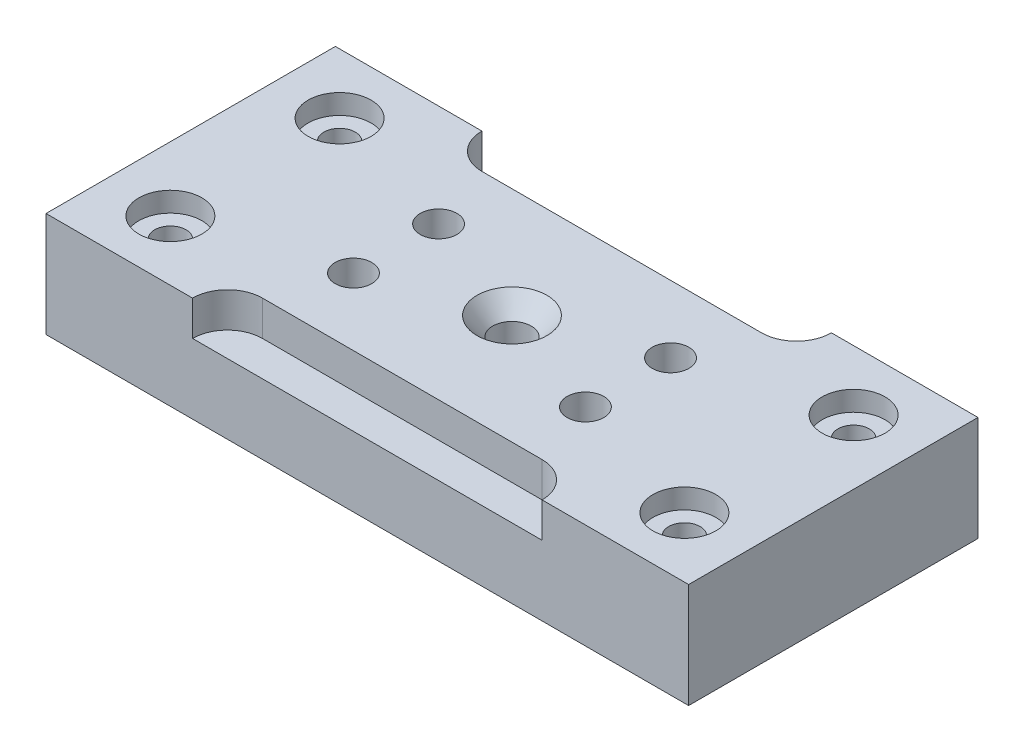
ISO-10303-21;
HEADER;
FILE_DESCRIPTION(('STEP AP214'),'2;1');
FILE_NAME('part.step','',(''),(''),'','','');
FILE_SCHEMA(('AUTOMOTIVE_DESIGN { 1 0 10303 214 1 1 1 1 }'));
ENDSEC;
DATA;
#1=APPLICATION_CONTEXT('core data for automotive mechanical design processes');
#2=APPLICATION_PROTOCOL_DEFINITION('international standard','automotive_design',2000,#1);
#3=PRODUCT_CONTEXT('',#1,'mechanical');
#4=PRODUCT('Part','Part','',(#3));
#5=PRODUCT_RELATED_PRODUCT_CATEGORY('part','',(#4));
#6=PRODUCT_DEFINITION_FORMATION('','',#4);
#7=PRODUCT_DEFINITION_CONTEXT('part definition',#1,'design');
#8=PRODUCT_DEFINITION('design','',#6,#7);
#9=PRODUCT_DEFINITION_SHAPE('','',#8);
#10=(LENGTH_UNIT() NAMED_UNIT(*) SI_UNIT(.MILLI.,.METRE.));
#11=(NAMED_UNIT(*) PLANE_ANGLE_UNIT() SI_UNIT($,.RADIAN.));
#12=(NAMED_UNIT(*) SI_UNIT($,.STERADIAN.) SOLID_ANGLE_UNIT());
#13=UNCERTAINTY_MEASURE_WITH_UNIT(LENGTH_MEASURE(1.E-05),#10,'distance_accuracy_value','');
#14=(GEOMETRIC_REPRESENTATION_CONTEXT(3) GLOBAL_UNCERTAINTY_ASSIGNED_CONTEXT((#13)) GLOBAL_UNIT_ASSIGNED_CONTEXT((#10,
#11,#12)) REPRESENTATION_CONTEXT('',''));
#15=CARTESIAN_POINT('',(0.,0.,0.));
#16=DIRECTION('',(0.,0.,1.));
#17=DIRECTION('',(1.,0.,0.));
#18=AXIS2_PLACEMENT_3D('',#15,#16,#17);
#19=CARTESIAN_POINT('',(0.,30.,0.));
#20=DIRECTION('',(0.,-1.,0.));
#21=DIRECTION('',(0.,0.,-1.));
#22=AXIS2_PLACEMENT_3D('',#19,#20,#21);
#23=PLANE('',#22);
#24=CARTESIAN_POINT('',(33.1797050328268,30.,12.1730735997061));
#25=DIRECTION('',(0.,1.,0.));
#26=DIRECTION('',(0.,0.,1.));
#27=AXIS2_PLACEMENT_3D('',#24,#25,#26);
#28=CIRCLE('',#27,5.25);
#29=CARTESIAN_POINT('',(33.1797050328268,30.,17.423073599706));
#30=VERTEX_POINT('',#29);
#31=EDGE_CURVE('E374',#30,#30,#28,.T.);
#32=ORIENTED_EDGE('',*,*,#31,.F.);
#33=EDGE_LOOP('',(#32));
#34=FACE_BOUND('',#33,.T.);
#35=CARTESIAN_POINT('',(33.1797050328268,30.,-12.1730735997061));
#36=DIRECTION('',(0.,1.,0.));
#37=DIRECTION('',(0.,0.,1.));
#38=AXIS2_PLACEMENT_3D('',#35,#36,#37);
#39=CIRCLE('',#38,5.25);
#40=CARTESIAN_POINT('',(33.1797050328268,30.,-6.92307359970605));
#41=VERTEX_POINT('',#40);
#42=EDGE_CURVE('E373',#41,#41,#39,.T.);
#43=ORIENTED_EDGE('',*,*,#42,.F.);
#44=EDGE_LOOP('',(#43));
#45=FACE_BOUND('',#44,.T.);
#46=CARTESIAN_POINT('',(-33.1797050328268,30.,12.1730735997061));
#47=DIRECTION('',(0.,1.,0.));
#48=DIRECTION('',(0.,0.,1.));
#49=AXIS2_PLACEMENT_3D('',#46,#47,#48);
#50=CIRCLE('',#49,5.25);
#51=CARTESIAN_POINT('',(-33.1797050328268,30.,17.423073599706));
#52=VERTEX_POINT('',#51);
#53=EDGE_CURVE('E384',#52,#52,#50,.T.);
#54=ORIENTED_EDGE('',*,*,#53,.F.);
#55=EDGE_LOOP('',(#54));
#56=FACE_BOUND('',#55,.T.);
#57=CARTESIAN_POINT('',(-33.1797050328268,30.,-12.1730735997061));
#58=DIRECTION('',(0.,1.,0.));
#59=DIRECTION('',(0.,0.,1.));
#60=AXIS2_PLACEMENT_3D('',#57,#58,#59);
#61=CIRCLE('',#60,5.25);
#62=CARTESIAN_POINT('',(-33.1797050328268,30.,-6.92307359970605));
#63=VERTEX_POINT('',#62);
#64=EDGE_CURVE('E390',#63,#63,#61,.T.);
#65=ORIENTED_EDGE('',*,*,#64,.F.);
#66=EDGE_LOOP('',(#65));
#67=FACE_BOUND('',#66,.T.);
#68=DIRECTION('',(-1.,0.,0.));
#69=VECTOR('',#68,1.);
#70=CARTESIAN_POINT('',(-91.9250024387865,30.,-41.3923661549649));
#71=LINE('',#70,#69);
#72=CARTESIAN_POINT('',(91.9250024387865,30.,-41.3923661549649));
#73=VERTEX_POINT('',#72);
#74=CARTESIAN_POINT('',(50.,30.,-41.3923661549649));
#75=VERTEX_POINT('',#74);
#76=EDGE_CURVE('E504',#73,#75,#71,.T.);
#77=ORIENTED_EDGE('',*,*,#76,.T.);
#78=CARTESIAN_POINT('',(40.,30.,-41.3923661549649));
#79=DIRECTION('',(0.,1.,0.));
#80=DIRECTION('',(0.,0.,1.));
#81=AXIS2_PLACEMENT_3D('',#78,#79,#80);
#82=CIRCLE('',#81,9.99999999999999);
#83=CARTESIAN_POINT('',(40.,30.,-31.392366154965));
#84=VERTEX_POINT('',#83);
#85=EDGE_CURVE('E407',#84,#75,#82,.T.);
#86=ORIENTED_EDGE('',*,*,#85,.F.);
#87=DIRECTION('',(1.,0.,0.));
#88=VECTOR('',#87,1.);
#89=CARTESIAN_POINT('',(-40.,30.,-31.392366154965));
#90=LINE('',#89,#88);
#91=CARTESIAN_POINT('',(-40.,30.,-31.3923661549649));
#92=VERTEX_POINT('',#91);
#93=EDGE_CURVE('E396',#92,#84,#90,.T.);
#94=ORIENTED_EDGE('',*,*,#93,.F.);
#95=CARTESIAN_POINT('',(-40.,30.,-41.3923661549649));
#96=DIRECTION('',(0.,1.,0.));
#97=DIRECTION('',(0.,0.,1.));
#98=AXIS2_PLACEMENT_3D('',#95,#96,#97);
#99=CIRCLE('',#98,9.99999999999999);
#100=CARTESIAN_POINT('',(-50.,30.,-41.3923661549649));
#101=VERTEX_POINT('',#100);
#102=EDGE_CURVE('E401',#101,#92,#99,.T.);
#103=ORIENTED_EDGE('',*,*,#102,.F.);
#104=CARTESIAN_POINT('',(-91.9250024387865,30.,-41.3923661549649));
#105=VERTEX_POINT('',#104);
#106=EDGE_CURVE('E502',#101,#105,#71,.T.);
#107=ORIENTED_EDGE('',*,*,#106,.T.);
#108=DIRECTION('',(0.,0.,1.));
#109=VECTOR('',#108,1.);
#110=CARTESIAN_POINT('',(-91.9250024387865,30.,41.3923661549649));
#111=LINE('',#110,#109);
#112=CARTESIAN_POINT('',(-91.9250024387865,30.,41.3923661549649));
#113=VERTEX_POINT('',#112);
#114=EDGE_CURVE('E507',#105,#113,#111,.T.);
#115=ORIENTED_EDGE('',*,*,#114,.T.);
#116=DIRECTION('',(1.,0.,0.));
#117=VECTOR('',#116,1.);
#118=CARTESIAN_POINT('',(-91.9250024387865,30.,41.3923661549649));
#119=LINE('',#118,#117);
#120=CARTESIAN_POINT('',(-50.,30.,41.3923661549649));
#121=VERTEX_POINT('',#120);
#122=EDGE_CURVE('E510',#113,#121,#119,.T.);
#123=ORIENTED_EDGE('',*,*,#122,.T.);
#124=CARTESIAN_POINT('',(-40.,30.,41.3923661549649));
#125=DIRECTION('',(0.,1.,0.));
#126=DIRECTION('',(0.,0.,1.));
#127=AXIS2_PLACEMENT_3D('',#124,#125,#126);
#128=CIRCLE('',#127,9.99999999999999);
#129=CARTESIAN_POINT('',(-40.,30.,31.3923661549649));
#130=VERTEX_POINT('',#129);
#131=EDGE_CURVE('E420',#130,#121,#128,.T.);
#132=ORIENTED_EDGE('',*,*,#131,.F.);
#133=DIRECTION('',(1.,0.,0.));
#134=VECTOR('',#133,1.);
#135=CARTESIAN_POINT('',(-40.,30.,31.3923661549649));
#136=LINE('',#135,#134);
#137=CARTESIAN_POINT('',(40.,30.,31.3923661549649));
#138=VERTEX_POINT('',#137);
#139=EDGE_CURVE('E417',#130,#138,#136,.T.);
#140=ORIENTED_EDGE('',*,*,#139,.T.);
#141=CARTESIAN_POINT('',(40.,30.,41.3923661549649));
#142=DIRECTION('',(0.,1.,0.));
#143=DIRECTION('',(0.,0.,1.));
#144=AXIS2_PLACEMENT_3D('',#141,#142,#143);
#145=CIRCLE('',#144,9.99999999999999);
#146=CARTESIAN_POINT('',(50.,30.,41.3923661549649));
#147=VERTEX_POINT('',#146);
#148=EDGE_CURVE('E429',#147,#138,#145,.T.);
#149=ORIENTED_EDGE('',*,*,#148,.F.);
#150=CARTESIAN_POINT('',(91.9250024387865,30.,41.3923661549649));
#151=VERTEX_POINT('',#150);
#152=EDGE_CURVE('E509',#147,#151,#119,.T.);
#153=ORIENTED_EDGE('',*,*,#152,.T.);
#154=DIRECTION('',(0.,0.,-1.));
#155=VECTOR('',#154,1.);
#156=CARTESIAN_POINT('',(91.9250024387865,30.,41.3923661549649));
#157=LINE('',#156,#155);
#158=EDGE_CURVE('E499',#151,#73,#157,.T.);
#159=ORIENTED_EDGE('',*,*,#158,.T.);
#160=EDGE_LOOP('',(#77,#86,#94,#103,#107,#115,#123,#132,#140,#149,#153,#159));
#161=FACE_BOUND('',#160,.T.);
#162=CARTESIAN_POINT('',(0.,30.,0.));
#163=DIRECTION('',(0.,1.,0.));
#164=DIRECTION('',(0.,0.,1.));
#165=AXIS2_PLACEMENT_3D('',#162,#163,#164);
#166=CIRCLE('',#165,10.);
#167=CARTESIAN_POINT('',(0.,30.,10.));
#168=VERTEX_POINT('',#167);
#169=EDGE_CURVE('E489',#168,#168,#166,.T.);
#170=ORIENTED_EDGE('',*,*,#169,.F.);
#171=EDGE_LOOP('',(#170));
#172=FACE_BOUND('',#171,.T.);
#173=CARTESIAN_POINT('',(-73.5278112496764,30.,-24.202787728812));
#174=DIRECTION('',(0.,1.,0.));
#175=DIRECTION('',(0.,0.,1.));
#176=AXIS2_PLACEMENT_3D('',#173,#174,#175);
#177=CIRCLE('',#176,9.005);
#178=CARTESIAN_POINT('',(-73.5278112496764,30.,-15.197787728812));
#179=VERTEX_POINT('',#178);
#180=EDGE_CURVE('E477',#179,#179,#177,.T.);
#181=ORIENTED_EDGE('',*,*,#180,.F.);
#182=EDGE_LOOP('',(#181));
#183=FACE_BOUND('',#182,.T.);
#184=CARTESIAN_POINT('',(-73.5278112496764,30.,24.202787728812));
#185=DIRECTION('',(0.,1.,0.));
#186=DIRECTION('',(0.,0.,1.));
#187=AXIS2_PLACEMENT_3D('',#184,#185,#186);
#188=CIRCLE('',#187,9.005);
#189=CARTESIAN_POINT('',(-73.5278112496764,30.,33.207787728812));
#190=VERTEX_POINT('',#189);
#191=EDGE_CURVE('E465',#190,#190,#188,.T.);
#192=ORIENTED_EDGE('',*,*,#191,.F.);
#193=EDGE_LOOP('',(#192));
#194=FACE_BOUND('',#193,.T.);
#195=CARTESIAN_POINT('',(73.5278112496764,30.,-24.202787728812));
#196=DIRECTION('',(0.,1.,0.));
#197=DIRECTION('',(0.,0.,1.));
#198=AXIS2_PLACEMENT_3D('',#195,#196,#197);
#199=CIRCLE('',#198,9.005);
#200=CARTESIAN_POINT('',(73.5278112496764,30.,-15.197787728812));
#201=VERTEX_POINT('',#200);
#202=EDGE_CURVE('E453',#201,#201,#199,.T.);
#203=ORIENTED_EDGE('',*,*,#202,.F.);
#204=EDGE_LOOP('',(#203));
#205=FACE_BOUND('',#204,.T.);
#206=CARTESIAN_POINT('',(73.5278112496764,30.,24.202787728812));
#207=DIRECTION('',(0.,1.,0.));
#208=DIRECTION('',(0.,0.,1.));
#209=AXIS2_PLACEMENT_3D('',#206,#207,#208);
#210=CIRCLE('',#209,9.005);
#211=CARTESIAN_POINT('',(73.5278112496764,30.,33.207787728812));
#212=VERTEX_POINT('',#211);
#213=EDGE_CURVE('E441',#212,#212,#210,.T.);
#214=ORIENTED_EDGE('',*,*,#213,.F.);
#215=EDGE_LOOP('',(#214));
#216=FACE_BOUND('',#215,.T.);
#217=ADVANCED_FACE('F263',(#34,#45,#56,#67,#161,#172,#183,#194,#205,#216),#23,.F.);
#218=CARTESIAN_POINT('',(91.9250024387865,30.,41.3923661549649));
#219=DIRECTION('',(-1.,0.,0.));
#220=DIRECTION('',(0.,0.,1.));
#221=AXIS2_PLACEMENT_3D('',#218,#219,#220);
#222=PLANE('',#221);
#223=DIRECTION('',(0.,0.,-1.));
#224=VECTOR('',#223,1.);
#225=CARTESIAN_POINT('',(91.9250024387865,0.,41.3923661549649));
#226=LINE('',#225,#224);
#227=CARTESIAN_POINT('',(91.9250024387865,0.,41.3923661549649));
#228=VERTEX_POINT('',#227);
#229=CARTESIAN_POINT('',(91.9250024387865,0.,-41.3923661549649));
#230=VERTEX_POINT('',#229);
#231=EDGE_CURVE('E498',#228,#230,#226,.T.);
#232=ORIENTED_EDGE('',*,*,#231,.T.);
#233=DIRECTION('',(0.,-1.,0.));
#234=VECTOR('',#233,1.);
#235=CARTESIAN_POINT('',(91.9250024387865,30.,-41.3923661549649));
#236=LINE('',#235,#234);
#237=EDGE_CURVE('E432',#73,#230,#236,.T.);
#238=ORIENTED_EDGE('',*,*,#237,.F.);
#239=ORIENTED_EDGE('',*,*,#158,.F.);
#240=DIRECTION('',(0.,-1.,0.));
#241=VECTOR('',#240,1.);
#242=CARTESIAN_POINT('',(91.9250024387865,30.,41.3923661549649));
#243=LINE('',#242,#241);
#244=EDGE_CURVE('E513',#151,#228,#243,.T.);
#245=ORIENTED_EDGE('',*,*,#244,.T.);
#246=EDGE_LOOP('',(#232,#238,#239,#245));
#247=FACE_BOUND('',#246,.T.);
#248=ADVANCED_FACE('F265',(#247),#222,.F.);
#249=CARTESIAN_POINT('',(-91.9250024387865,30.,-41.3923661549649));
#250=DIRECTION('',(0.,0.,1.));
#251=DIRECTION('',(1.,0.,0.));
#252=AXIS2_PLACEMENT_3D('',#249,#250,#251);
#253=PLANE('',#252);
#254=DIRECTION('',(1.,0.,0.));
#255=VECTOR('',#254,1.);
#256=CARTESIAN_POINT('',(-91.9250024387865,20.,-41.3923661549649));
#257=LINE('',#256,#255);
#258=CARTESIAN_POINT('',(-50.,20.,-41.3923661549649));
#259=VERTEX_POINT('',#258);
#260=CARTESIAN_POINT('',(50.,20.,-41.3923661549649));
#261=VERTEX_POINT('',#260);
#262=EDGE_CURVE('E271',#259,#261,#257,.T.);
#263=ORIENTED_EDGE('',*,*,#262,.T.);
#264=DIRECTION('',(0.,1.,0.));
#265=VECTOR('',#264,1.);
#266=CARTESIAN_POINT('',(50.,30.,-41.3923661549649));
#267=LINE('',#266,#265);
#268=EDGE_CURVE('E13',#261,#75,#267,.T.);
#269=ORIENTED_EDGE('',*,*,#268,.T.);
#270=ORIENTED_EDGE('',*,*,#76,.F.);
#271=ORIENTED_EDGE('',*,*,#237,.T.);
#272=DIRECTION('',(-1.,0.,0.));
#273=VECTOR('',#272,1.);
#274=CARTESIAN_POINT('',(-91.9250024387865,0.,-41.3923661549649));
#275=LINE('',#274,#273);
#276=CARTESIAN_POINT('',(-91.9250024387865,0.,-41.3923661549649));
#277=VERTEX_POINT('',#276);
#278=EDGE_CURVE('E516',#230,#277,#275,.T.);
#279=ORIENTED_EDGE('',*,*,#278,.T.);
#280=DIRECTION('',(0.,-1.,0.));
#281=VECTOR('',#280,1.);
#282=CARTESIAN_POINT('',(-91.9250024387865,30.,-41.3923661549649));
#283=LINE('',#282,#281);
#284=EDGE_CURVE('E526',#105,#277,#283,.T.);
#285=ORIENTED_EDGE('',*,*,#284,.F.);
#286=ORIENTED_EDGE('',*,*,#106,.F.);
#287=DIRECTION('',(0.,1.,0.));
#288=VECTOR('',#287,1.);
#289=CARTESIAN_POINT('',(-50.,30.,-41.3923661549649));
#290=LINE('',#289,#288);
#291=EDGE_CURVE('E533',#101,#259,#290,.F.);
#292=ORIENTED_EDGE('',*,*,#291,.T.);
#293=EDGE_LOOP('',(#263,#269,#270,#271,#279,#285,#286,#292));
#294=FACE_BOUND('',#293,.T.);
#295=ADVANCED_FACE('F537',(#294),#253,.F.);
#296=CARTESIAN_POINT('',(-91.9250024387865,30.,41.3923661549649));
#297=DIRECTION('',(1.,0.,0.));
#298=DIRECTION('',(0.,0.,-1.));
#299=AXIS2_PLACEMENT_3D('',#296,#297,#298);
#300=PLANE('',#299);
#301=DIRECTION('',(0.,0.,1.));
#302=VECTOR('',#301,1.);
#303=CARTESIAN_POINT('',(-91.9250024387865,0.,41.3923661549649));
#304=LINE('',#303,#302);
#305=CARTESIAN_POINT('',(-91.9250024387865,0.,41.3923661549649));
#306=VERTEX_POINT('',#305);
#307=EDGE_CURVE('E518',#277,#306,#304,.T.);
#308=ORIENTED_EDGE('',*,*,#307,.T.);
#309=DIRECTION('',(0.,-1.,0.));
#310=VECTOR('',#309,1.);
#311=CARTESIAN_POINT('',(-91.9250024387865,30.,41.3923661549649));
#312=LINE('',#311,#310);
#313=EDGE_CURVE('E523',#113,#306,#312,.T.);
#314=ORIENTED_EDGE('',*,*,#313,.F.);
#315=ORIENTED_EDGE('',*,*,#114,.F.);
#316=ORIENTED_EDGE('',*,*,#284,.T.);
#317=EDGE_LOOP('',(#308,#314,#315,#316));
#318=FACE_BOUND('',#317,.T.);
#319=ADVANCED_FACE('F562',(#318),#300,.F.);
#320=CARTESIAN_POINT('',(-91.9250024387865,30.,41.3923661549649));
#321=DIRECTION('',(0.,0.,-1.));
#322=DIRECTION('',(-1.,0.,0.));
#323=AXIS2_PLACEMENT_3D('',#320,#321,#322);
#324=PLANE('',#323);
#325=DIRECTION('',(-1.,0.,0.));
#326=VECTOR('',#325,1.);
#327=CARTESIAN_POINT('',(-91.9250024387865,20.,41.3923661549649));
#328=LINE('',#327,#326);
#329=CARTESIAN_POINT('',(50.,20.,41.3923661549649));
#330=VERTEX_POINT('',#329);
#331=CARTESIAN_POINT('',(-50.,20.,41.3923661549649));
#332=VERTEX_POINT('',#331);
#333=EDGE_CURVE('E431',#330,#332,#328,.T.);
#334=ORIENTED_EDGE('',*,*,#333,.T.);
#335=DIRECTION('',(0.,1.,0.));
#336=VECTOR('',#335,1.);
#337=CARTESIAN_POINT('',(-50.,30.,41.3923661549649));
#338=LINE('',#337,#336);
#339=EDGE_CURVE('E435',#332,#121,#338,.T.);
#340=ORIENTED_EDGE('',*,*,#339,.T.);
#341=ORIENTED_EDGE('',*,*,#122,.F.);
#342=ORIENTED_EDGE('',*,*,#313,.T.);
#343=DIRECTION('',(1.,0.,0.));
#344=VECTOR('',#343,1.);
#345=CARTESIAN_POINT('',(-91.9250024387865,0.,41.3923661549649));
#346=LINE('',#345,#344);
#347=EDGE_CURVE('E503',#306,#228,#346,.T.);
#348=ORIENTED_EDGE('',*,*,#347,.T.);
#349=ORIENTED_EDGE('',*,*,#244,.F.);
#350=ORIENTED_EDGE('',*,*,#152,.F.);
#351=DIRECTION('',(0.,1.,0.));
#352=VECTOR('',#351,1.);
#353=CARTESIAN_POINT('',(50.,30.,41.3923661549649));
#354=LINE('',#353,#352);
#355=EDGE_CURVE('E438',#147,#330,#354,.F.);
#356=ORIENTED_EDGE('',*,*,#355,.T.);
#357=EDGE_LOOP('',(#334,#340,#341,#342,#348,#349,#350,#356));
#358=FACE_BOUND('',#357,.T.);
#359=ADVANCED_FACE('F566',(#358),#324,.F.);
#360=CARTESIAN_POINT('',(0.,0.,0.));
#361=DIRECTION('',(0.,-1.,0.));
#362=DIRECTION('',(0.,0.,-1.));
#363=AXIS2_PLACEMENT_3D('',#360,#361,#362);
#364=PLANE('',#363);
#365=CARTESIAN_POINT('',(73.5278112496764,0.,24.202787728812));
#366=DIRECTION('',(0.,-1.,0.));
#367=DIRECTION('',(0.,0.,-1.));
#368=AXIS2_PLACEMENT_3D('',#365,#366,#367);
#369=CIRCLE('',#368,4.5);
#370=CARTESIAN_POINT('',(73.5278112496764,0.,19.702787728812));
#371=VERTEX_POINT('',#370);
#372=EDGE_CURVE('E450',#371,#371,#369,.T.);
#373=ORIENTED_EDGE('',*,*,#372,.F.);
#374=EDGE_LOOP('',(#373));
#375=FACE_BOUND('',#374,.T.);
#376=CARTESIAN_POINT('',(73.5278112496764,0.,-24.202787728812));
#377=DIRECTION('',(0.,-1.,0.));
#378=DIRECTION('',(0.,0.,-1.));
#379=AXIS2_PLACEMENT_3D('',#376,#377,#378);
#380=CIRCLE('',#379,4.5);
#381=CARTESIAN_POINT('',(73.5278112496764,0.,-28.702787728812));
#382=VERTEX_POINT('',#381);
#383=EDGE_CURVE('E462',#382,#382,#380,.T.);
#384=ORIENTED_EDGE('',*,*,#383,.F.);
#385=EDGE_LOOP('',(#384));
#386=FACE_BOUND('',#385,.T.);
#387=CARTESIAN_POINT('',(-73.5278112496764,0.,24.202787728812));
#388=DIRECTION('',(0.,-1.,0.));
#389=DIRECTION('',(0.,0.,-1.));
#390=AXIS2_PLACEMENT_3D('',#387,#388,#389);
#391=CIRCLE('',#390,4.5);
#392=CARTESIAN_POINT('',(-73.5278112496764,0.,19.702787728812));
#393=VERTEX_POINT('',#392);
#394=EDGE_CURVE('E474',#393,#393,#391,.T.);
#395=ORIENTED_EDGE('',*,*,#394,.F.);
#396=EDGE_LOOP('',(#395));
#397=FACE_BOUND('',#396,.T.);
#398=CARTESIAN_POINT('',(-73.5278112496764,0.,-24.202787728812));
#399=DIRECTION('',(0.,-1.,0.));
#400=DIRECTION('',(0.,0.,-1.));
#401=AXIS2_PLACEMENT_3D('',#398,#399,#400);
#402=CIRCLE('',#401,4.5);
#403=CARTESIAN_POINT('',(-73.5278112496764,0.,-28.702787728812));
#404=VERTEX_POINT('',#403);
#405=EDGE_CURVE('E486',#404,#404,#402,.T.);
#406=ORIENTED_EDGE('',*,*,#405,.F.);
#407=EDGE_LOOP('',(#406));
#408=FACE_BOUND('',#407,.T.);
#409=CARTESIAN_POINT('',(0.,0.,0.));
#410=DIRECTION('',(0.,-1.,0.));
#411=DIRECTION('',(0.,0.,-1.));
#412=AXIS2_PLACEMENT_3D('',#409,#410,#411);
#413=CIRCLE('',#412,5.49999999999999);
#414=CARTESIAN_POINT('',(0.,0.,-5.49999999999999));
#415=VERTEX_POINT('',#414);
#416=EDGE_CURVE('E495',#415,#415,#413,.T.);
#417=ORIENTED_EDGE('',*,*,#416,.F.);
#418=EDGE_LOOP('',(#417));
#419=FACE_BOUND('',#418,.T.);
#420=ORIENTED_EDGE('',*,*,#231,.F.);
#421=ORIENTED_EDGE('',*,*,#347,.F.);
#422=ORIENTED_EDGE('',*,*,#307,.F.);
#423=ORIENTED_EDGE('',*,*,#278,.F.);
#424=EDGE_LOOP('',(#420,#421,#422,#423));
#425=FACE_BOUND('',#424,.T.);
#426=ADVANCED_FACE('F558',(#375,#386,#397,#408,#419,#425),#364,.T.);
#427=CARTESIAN_POINT('',(0.,30.,0.));
#428=DIRECTION('',(0.,1.,0.));
#429=DIRECTION('',(0.,0.,1.));
#430=AXIS2_PLACEMENT_3D('',#427,#428,#429);
#431=CYLINDRICAL_SURFACE('',#430,5.49999999999999);
#432=CARTESIAN_POINT('',(0.,24.637108833326,0.));
#433=DIRECTION('',(0.,1.,0.));
#434=DIRECTION('',(0.,0.,1.));
#435=AXIS2_PLACEMENT_3D('',#432,#433,#434);
#436=CIRCLE('',#435,5.5);
#437=CARTESIAN_POINT('',(0.,24.637108833326,5.5));
#438=VERTEX_POINT('',#437);
#439=EDGE_CURVE('E492',#438,#438,#436,.T.);
#440=ORIENTED_EDGE('',*,*,#439,.T.);
#441=EDGE_LOOP('',(#440));
#442=FACE_BOUND('',#441,.T.);
#443=ORIENTED_EDGE('',*,*,#416,.T.);
#444=EDGE_LOOP('',(#443));
#445=FACE_BOUND('',#444,.T.);
#446=ADVANCED_FACE('F592',(#442,#445),#431,.F.);
#447=CARTESIAN_POINT('',(0.,30.,0.));
#448=DIRECTION('',(0.,1.,0.));
#449=DIRECTION('',(0.,0.,1.));
#450=AXIS2_PLACEMENT_3D('',#447,#448,#449);
#451=CONICAL_SURFACE('',#450,10.,0.698131700797732);
#452=ORIENTED_EDGE('',*,*,#439,.F.);
#453=EDGE_LOOP('',(#452));
#454=FACE_BOUND('',#453,.T.);
#455=ORIENTED_EDGE('',*,*,#169,.T.);
#456=EDGE_LOOP('',(#455));
#457=FACE_BOUND('',#456,.T.);
#458=ADVANCED_FACE('F629',(#454,#457),#451,.F.);
#459=CARTESIAN_POINT('',(-73.5278112496764,30.,-24.202787728812));
#460=DIRECTION('',(0.,1.,0.));
#461=DIRECTION('',(0.,0.,1.));
#462=AXIS2_PLACEMENT_3D('',#459,#460,#461);
#463=CYLINDRICAL_SURFACE('',#462,4.5);
#464=CARTESIAN_POINT('',(-73.5278112496764,24.32,-24.202787728812));
#465=DIRECTION('',(0.,1.,0.));
#466=DIRECTION('',(0.,0.,1.));
#467=AXIS2_PLACEMENT_3D('',#464,#465,#466);
#468=CIRCLE('',#467,4.5);
#469=CARTESIAN_POINT('',(-73.5278112496764,24.32,-19.702787728812));
#470=VERTEX_POINT('',#469);
#471=EDGE_CURVE('E483',#470,#470,#468,.T.);
#472=ORIENTED_EDGE('',*,*,#471,.T.);
#473=EDGE_LOOP('',(#472));
#474=FACE_BOUND('',#473,.T.);
#475=ORIENTED_EDGE('',*,*,#405,.T.);
#476=EDGE_LOOP('',(#475));
#477=FACE_BOUND('',#476,.T.);
#478=ADVANCED_FACE('F636',(#474,#477),#463,.F.);
#479=CARTESIAN_POINT('',(-69.0278112496764,24.32,-24.202787728812));
#480=DIRECTION('',(0.,-1.,0.));
#481=DIRECTION('',(0.,0.,-1.));
#482=AXIS2_PLACEMENT_3D('',#479,#480,#481);
#483=PLANE('',#482);
#484=ORIENTED_EDGE('',*,*,#471,.F.);
#485=EDGE_LOOP('',(#484));
#486=FACE_BOUND('',#485,.T.);
#487=CARTESIAN_POINT('',(-73.5278112496764,24.32,-24.202787728812));
#488=DIRECTION('',(0.,1.,0.));
#489=DIRECTION('',(0.,0.,1.));
#490=AXIS2_PLACEMENT_3D('',#487,#488,#489);
#491=CIRCLE('',#490,9.005);
#492=CARTESIAN_POINT('',(-73.5278112496764,24.32,-15.197787728812));
#493=VERTEX_POINT('',#492);
#494=EDGE_CURVE('E480',#493,#493,#491,.T.);
#495=ORIENTED_EDGE('',*,*,#494,.T.);
#496=EDGE_LOOP('',(#495));
#497=FACE_BOUND('',#496,.T.);
#498=ADVANCED_FACE('F643',(#486,#497),#483,.F.);
#499=CARTESIAN_POINT('',(-73.5278112496764,30.,-24.202787728812));
#500=DIRECTION('',(0.,1.,0.));
#501=DIRECTION('',(0.,0.,1.));
#502=AXIS2_PLACEMENT_3D('',#499,#500,#501);
#503=CYLINDRICAL_SURFACE('',#502,9.005);
#504=ORIENTED_EDGE('',*,*,#494,.F.);
#505=EDGE_LOOP('',(#504));
#506=FACE_BOUND('',#505,.T.);
#507=ORIENTED_EDGE('',*,*,#180,.T.);
#508=EDGE_LOOP('',(#507));
#509=FACE_BOUND('',#508,.T.);
#510=ADVANCED_FACE('F651',(#506,#509),#503,.F.);
#511=CARTESIAN_POINT('',(-73.5278112496764,30.,24.202787728812));
#512=DIRECTION('',(0.,1.,0.));
#513=DIRECTION('',(0.,0.,1.));
#514=AXIS2_PLACEMENT_3D('',#511,#512,#513);
#515=CYLINDRICAL_SURFACE('',#514,4.5);
#516=CARTESIAN_POINT('',(-73.5278112496764,24.32,24.202787728812));
#517=DIRECTION('',(0.,1.,0.));
#518=DIRECTION('',(0.,0.,1.));
#519=AXIS2_PLACEMENT_3D('',#516,#517,#518);
#520=CIRCLE('',#519,4.5);
#521=CARTESIAN_POINT('',(-73.5278112496764,24.32,28.702787728812));
#522=VERTEX_POINT('',#521);
#523=EDGE_CURVE('E471',#522,#522,#520,.T.);
#524=ORIENTED_EDGE('',*,*,#523,.T.);
#525=EDGE_LOOP('',(#524));
#526=FACE_BOUND('',#525,.T.);
#527=ORIENTED_EDGE('',*,*,#394,.T.);
#528=EDGE_LOOP('',(#527));
#529=FACE_BOUND('',#528,.T.);
#530=ADVANCED_FACE('F659',(#526,#529),#515,.F.);
#531=CARTESIAN_POINT('',(-69.0278112496764,24.32,24.202787728812));
#532=DIRECTION('',(0.,-1.,0.));
#533=DIRECTION('',(0.,0.,-1.));
#534=AXIS2_PLACEMENT_3D('',#531,#532,#533);
#535=PLANE('',#534);
#536=ORIENTED_EDGE('',*,*,#523,.F.);
#537=EDGE_LOOP('',(#536));
#538=FACE_BOUND('',#537,.T.);
#539=CARTESIAN_POINT('',(-73.5278112496764,24.32,24.202787728812));
#540=DIRECTION('',(0.,1.,0.));
#541=DIRECTION('',(0.,0.,1.));
#542=AXIS2_PLACEMENT_3D('',#539,#540,#541);
#543=CIRCLE('',#542,9.005);
#544=CARTESIAN_POINT('',(-73.5278112496764,24.32,33.207787728812));
#545=VERTEX_POINT('',#544);
#546=EDGE_CURVE('E468',#545,#545,#543,.T.);
#547=ORIENTED_EDGE('',*,*,#546,.T.);
#548=EDGE_LOOP('',(#547));
#549=FACE_BOUND('',#548,.T.);
#550=ADVANCED_FACE('F667',(#538,#549),#535,.F.);
#551=CARTESIAN_POINT('',(-73.5278112496764,30.,24.202787728812));
#552=DIRECTION('',(0.,1.,0.));
#553=DIRECTION('',(0.,0.,1.));
#554=AXIS2_PLACEMENT_3D('',#551,#552,#553);
#555=CYLINDRICAL_SURFACE('',#554,9.005);
#556=ORIENTED_EDGE('',*,*,#546,.F.);
#557=EDGE_LOOP('',(#556));
#558=FACE_BOUND('',#557,.T.);
#559=ORIENTED_EDGE('',*,*,#191,.T.);
#560=EDGE_LOOP('',(#559));
#561=FACE_BOUND('',#560,.T.);
#562=ADVANCED_FACE('F675',(#558,#561),#555,.F.);
#563=CARTESIAN_POINT('',(73.5278112496764,30.,-24.202787728812));
#564=DIRECTION('',(0.,1.,0.));
#565=DIRECTION('',(0.,0.,1.));
#566=AXIS2_PLACEMENT_3D('',#563,#564,#565);
#567=CYLINDRICAL_SURFACE('',#566,4.5);
#568=CARTESIAN_POINT('',(73.5278112496764,24.32,-24.202787728812));
#569=DIRECTION('',(0.,1.,0.));
#570=DIRECTION('',(0.,0.,1.));
#571=AXIS2_PLACEMENT_3D('',#568,#569,#570);
#572=CIRCLE('',#571,4.5);
#573=CARTESIAN_POINT('',(73.5278112496764,24.32,-19.702787728812));
#574=VERTEX_POINT('',#573);
#575=EDGE_CURVE('E459',#574,#574,#572,.T.);
#576=ORIENTED_EDGE('',*,*,#575,.T.);
#577=EDGE_LOOP('',(#576));
#578=FACE_BOUND('',#577,.T.);
#579=ORIENTED_EDGE('',*,*,#383,.T.);
#580=EDGE_LOOP('',(#579));
#581=FACE_BOUND('',#580,.T.);
#582=ADVANCED_FACE('F682',(#578,#581),#567,.F.);
#583=CARTESIAN_POINT('',(78.0278112496764,24.32,-24.202787728812));
#584=DIRECTION('',(0.,-1.,0.));
#585=DIRECTION('',(0.,0.,-1.));
#586=AXIS2_PLACEMENT_3D('',#583,#584,#585);
#587=PLANE('',#586);
#588=ORIENTED_EDGE('',*,*,#575,.F.);
#589=EDGE_LOOP('',(#588));
#590=FACE_BOUND('',#589,.T.);
#591=CARTESIAN_POINT('',(73.5278112496764,24.32,-24.202787728812));
#592=DIRECTION('',(0.,1.,0.));
#593=DIRECTION('',(0.,0.,1.));
#594=AXIS2_PLACEMENT_3D('',#591,#592,#593);
#595=CIRCLE('',#594,9.005);
#596=CARTESIAN_POINT('',(73.5278112496764,24.32,-15.197787728812));
#597=VERTEX_POINT('',#596);
#598=EDGE_CURVE('E456',#597,#597,#595,.T.);
#599=ORIENTED_EDGE('',*,*,#598,.T.);
#600=EDGE_LOOP('',(#599));
#601=FACE_BOUND('',#600,.T.);
#602=ADVANCED_FACE('F689',(#590,#601),#587,.F.);
#603=CARTESIAN_POINT('',(73.5278112496764,30.,-24.202787728812));
#604=DIRECTION('',(0.,1.,0.));
#605=DIRECTION('',(0.,0.,1.));
#606=AXIS2_PLACEMENT_3D('',#603,#604,#605);
#607=CYLINDRICAL_SURFACE('',#606,9.005);
#608=ORIENTED_EDGE('',*,*,#598,.F.);
#609=EDGE_LOOP('',(#608));
#610=FACE_BOUND('',#609,.T.);
#611=ORIENTED_EDGE('',*,*,#202,.T.);
#612=EDGE_LOOP('',(#611));
#613=FACE_BOUND('',#612,.T.);
#614=ADVANCED_FACE('F697',(#610,#613),#607,.F.);
#615=CARTESIAN_POINT('',(73.5278112496764,30.,24.202787728812));
#616=DIRECTION('',(0.,1.,0.));
#617=DIRECTION('',(0.,0.,1.));
#618=AXIS2_PLACEMENT_3D('',#615,#616,#617);
#619=CYLINDRICAL_SURFACE('',#618,4.5);
#620=CARTESIAN_POINT('',(73.5278112496764,24.32,24.202787728812));
#621=DIRECTION('',(0.,1.,0.));
#622=DIRECTION('',(0.,0.,1.));
#623=AXIS2_PLACEMENT_3D('',#620,#621,#622);
#624=CIRCLE('',#623,4.5);
#625=CARTESIAN_POINT('',(73.5278112496764,24.32,28.702787728812));
#626=VERTEX_POINT('',#625);
#627=EDGE_CURVE('E447',#626,#626,#624,.T.);
#628=ORIENTED_EDGE('',*,*,#627,.T.);
#629=EDGE_LOOP('',(#628));
#630=FACE_BOUND('',#629,.T.);
#631=ORIENTED_EDGE('',*,*,#372,.T.);
#632=EDGE_LOOP('',(#631));
#633=FACE_BOUND('',#632,.T.);
#634=ADVANCED_FACE('F705',(#630,#633),#619,.F.);
#635=CARTESIAN_POINT('',(78.0278112496764,24.32,24.202787728812));
#636=DIRECTION('',(0.,-1.,0.));
#637=DIRECTION('',(0.,0.,-1.));
#638=AXIS2_PLACEMENT_3D('',#635,#636,#637);
#639=PLANE('',#638);
#640=ORIENTED_EDGE('',*,*,#627,.F.);
#641=EDGE_LOOP('',(#640));
#642=FACE_BOUND('',#641,.T.);
#643=CARTESIAN_POINT('',(73.5278112496764,24.32,24.202787728812));
#644=DIRECTION('',(0.,1.,0.));
#645=DIRECTION('',(0.,0.,1.));
#646=AXIS2_PLACEMENT_3D('',#643,#644,#645);
#647=CIRCLE('',#646,9.005);
#648=CARTESIAN_POINT('',(73.5278112496764,24.32,33.207787728812));
#649=VERTEX_POINT('',#648);
#650=EDGE_CURVE('E444',#649,#649,#647,.T.);
#651=ORIENTED_EDGE('',*,*,#650,.T.);
#652=EDGE_LOOP('',(#651));
#653=FACE_BOUND('',#652,.T.);
#654=ADVANCED_FACE('F713',(#642,#653),#639,.F.);
#655=CARTESIAN_POINT('',(73.5278112496764,30.,24.202787728812));
#656=DIRECTION('',(0.,1.,0.));
#657=DIRECTION('',(0.,0.,1.));
#658=AXIS2_PLACEMENT_3D('',#655,#656,#657);
#659=CYLINDRICAL_SURFACE('',#658,9.005);
#660=ORIENTED_EDGE('',*,*,#650,.F.);
#661=EDGE_LOOP('',(#660));
#662=FACE_BOUND('',#661,.T.);
#663=ORIENTED_EDGE('',*,*,#213,.T.);
#664=EDGE_LOOP('',(#663));
#665=FACE_BOUND('',#664,.T.);
#666=ADVANCED_FACE('F721',(#662,#665),#659,.F.);
#667=CARTESIAN_POINT('',(40.,20.,41.3923661549649));
#668=DIRECTION('',(0.,-1.,0.));
#669=DIRECTION('',(0.,0.,-1.));
#670=AXIS2_PLACEMENT_3D('',#667,#668,#669);
#671=PLANE('',#670);
#672=CARTESIAN_POINT('',(40.,20.,41.3923661549649));
#673=DIRECTION('',(0.,1.,0.));
#674=DIRECTION('',(0.,0.,1.));
#675=AXIS2_PLACEMENT_3D('',#672,#673,#674);
#676=CIRCLE('',#675,10.);
#677=CARTESIAN_POINT('',(40.,20.,31.3923661549649));
#678=VERTEX_POINT('',#677);
#679=EDGE_CURVE('E428',#330,#678,#676,.T.);
#680=ORIENTED_EDGE('',*,*,#679,.T.);
#681=DIRECTION('',(1.,0.,0.));
#682=VECTOR('',#681,1.);
#683=CARTESIAN_POINT('',(-40.,20.,31.3923661549649));
#684=LINE('',#683,#682);
#685=CARTESIAN_POINT('',(-40.,20.,31.3923661549649));
#686=VERTEX_POINT('',#685);
#687=EDGE_CURVE('E415',#686,#678,#684,.T.);
#688=ORIENTED_EDGE('',*,*,#687,.F.);
#689=CARTESIAN_POINT('',(-40.,20.,41.3923661549649));
#690=DIRECTION('',(0.,1.,0.));
#691=DIRECTION('',(0.,0.,1.));
#692=AXIS2_PLACEMENT_3D('',#689,#690,#691);
#693=CIRCLE('',#692,10.);
#694=EDGE_CURVE('E422',#686,#332,#693,.T.);
#695=ORIENTED_EDGE('',*,*,#694,.T.);
#696=ORIENTED_EDGE('',*,*,#333,.F.);
#697=EDGE_LOOP('',(#680,#688,#695,#696));
#698=FACE_BOUND('',#697,.T.);
#699=ADVANCED_FACE('F728',(#698),#671,.F.);
#700=CARTESIAN_POINT('',(40.,30.,41.3923661549649));
#701=DIRECTION('',(0.,1.,0.));
#702=DIRECTION('',(0.,0.,1.));
#703=AXIS2_PLACEMENT_3D('',#700,#701,#702);
#704=CYLINDRICAL_SURFACE('',#703,9.99999999999999);
#705=ORIENTED_EDGE('',*,*,#148,.T.);
#706=DIRECTION('',(0.,1.,0.));
#707=VECTOR('',#706,1.);
#708=CARTESIAN_POINT('',(40.,30.,31.3923661549649));
#709=LINE('',#708,#707);
#710=EDGE_CURVE('E286',#678,#138,#709,.T.);
#711=ORIENTED_EDGE('',*,*,#710,.F.);
#712=ORIENTED_EDGE('',*,*,#679,.F.);
#713=ORIENTED_EDGE('',*,*,#355,.F.);
#714=EDGE_LOOP('',(#705,#711,#712,#713));
#715=FACE_BOUND('',#714,.T.);
#716=ADVANCED_FACE('F735',(#715),#704,.F.);
#717=CARTESIAN_POINT('',(-40.,30.,41.3923661549649));
#718=DIRECTION('',(0.,1.,0.));
#719=DIRECTION('',(0.,0.,1.));
#720=AXIS2_PLACEMENT_3D('',#717,#718,#719);
#721=CYLINDRICAL_SURFACE('',#720,9.99999999999999);
#722=ORIENTED_EDGE('',*,*,#694,.F.);
#723=DIRECTION('',(0.,1.,0.));
#724=VECTOR('',#723,1.);
#725=CARTESIAN_POINT('',(-40.,30.,31.3923661549649));
#726=LINE('',#725,#724);
#727=EDGE_CURVE('E425',#130,#686,#726,.F.);
#728=ORIENTED_EDGE('',*,*,#727,.F.);
#729=ORIENTED_EDGE('',*,*,#131,.T.);
#730=ORIENTED_EDGE('',*,*,#339,.F.);
#731=EDGE_LOOP('',(#722,#728,#729,#730));
#732=FACE_BOUND('',#731,.T.);
#733=ADVANCED_FACE('F743',(#732),#721,.F.);
#734=CARTESIAN_POINT('',(-40.,30.,31.3923661549649));
#735=DIRECTION('',(0.,0.,-1.));
#736=DIRECTION('',(-1.,0.,0.));
#737=AXIS2_PLACEMENT_3D('',#734,#735,#736);
#738=PLANE('',#737);
#739=ORIENTED_EDGE('',*,*,#710,.T.);
#740=ORIENTED_EDGE('',*,*,#139,.F.);
#741=ORIENTED_EDGE('',*,*,#727,.T.);
#742=ORIENTED_EDGE('',*,*,#687,.T.);
#743=EDGE_LOOP('',(#739,#740,#741,#742));
#744=FACE_BOUND('',#743,.T.);
#745=ADVANCED_FACE('F751',(#744),#738,.F.);
#746=CARTESIAN_POINT('',(40.,20.,-41.3923661549649));
#747=DIRECTION('',(0.,-1.,0.));
#748=DIRECTION('',(0.,0.,-1.));
#749=AXIS2_PLACEMENT_3D('',#746,#747,#748);
#750=PLANE('',#749);
#751=CARTESIAN_POINT('',(-40.,20.,-41.3923661549649));
#752=DIRECTION('',(0.,1.,0.));
#753=DIRECTION('',(0.,0.,1.));
#754=AXIS2_PLACEMENT_3D('',#751,#752,#753);
#755=CIRCLE('',#754,10.);
#756=CARTESIAN_POINT('',(-40.,20.,-31.3923661549649));
#757=VERTEX_POINT('',#756);
#758=EDGE_CURVE('E278',#259,#757,#755,.T.);
#759=ORIENTED_EDGE('',*,*,#758,.T.);
#760=DIRECTION('',(1.,0.,0.));
#761=VECTOR('',#760,1.);
#762=CARTESIAN_POINT('',(-40.,20.,-31.3923661549649));
#763=LINE('',#762,#761);
#764=CARTESIAN_POINT('',(40.,20.,-31.3923661549649));
#765=VERTEX_POINT('',#764);
#766=EDGE_CURVE('E398',#757,#765,#763,.T.);
#767=ORIENTED_EDGE('',*,*,#766,.T.);
#768=CARTESIAN_POINT('',(40.,20.,-41.3923661549649));
#769=DIRECTION('',(0.,1.,0.));
#770=DIRECTION('',(0.,0.,1.));
#771=AXIS2_PLACEMENT_3D('',#768,#769,#770);
#772=CIRCLE('',#771,10.);
#773=EDGE_CURVE('E409',#765,#261,#772,.T.);
#774=ORIENTED_EDGE('',*,*,#773,.T.);
#775=ORIENTED_EDGE('',*,*,#262,.F.);
#776=EDGE_LOOP('',(#759,#767,#774,#775));
#777=FACE_BOUND('',#776,.T.);
#778=ADVANCED_FACE('F540',(#777),#750,.F.);
#779=CARTESIAN_POINT('',(40.,30.,-41.3923661549649));
#780=DIRECTION('',(0.,1.,0.));
#781=DIRECTION('',(0.,0.,1.));
#782=AXIS2_PLACEMENT_3D('',#779,#780,#781);
#783=CYLINDRICAL_SURFACE('',#782,9.99999999999999);
#784=ORIENTED_EDGE('',*,*,#773,.F.);
#785=DIRECTION('',(0.,1.,0.));
#786=VECTOR('',#785,1.);
#787=CARTESIAN_POINT('',(40.,30.,-31.3923661549649));
#788=LINE('',#787,#786);
#789=EDGE_CURVE('E412',#84,#765,#788,.F.);
#790=ORIENTED_EDGE('',*,*,#789,.F.);
#791=ORIENTED_EDGE('',*,*,#85,.T.);
#792=ORIENTED_EDGE('',*,*,#268,.F.);
#793=EDGE_LOOP('',(#784,#790,#791,#792));
#794=FACE_BOUND('',#793,.T.);
#795=ADVANCED_FACE('F544',(#794),#783,.F.);
#796=CARTESIAN_POINT('',(-40.,30.,-41.3923661549649));
#797=DIRECTION('',(0.,1.,0.));
#798=DIRECTION('',(0.,0.,1.));
#799=AXIS2_PLACEMENT_3D('',#796,#797,#798);
#800=CYLINDRICAL_SURFACE('',#799,9.99999999999999);
#801=ORIENTED_EDGE('',*,*,#102,.T.);
#802=DIRECTION('',(0.,1.,0.));
#803=VECTOR('',#802,1.);
#804=CARTESIAN_POINT('',(-40.,30.,-31.3923661549649));
#805=LINE('',#804,#803);
#806=EDGE_CURVE('E404',#757,#92,#805,.T.);
#807=ORIENTED_EDGE('',*,*,#806,.F.);
#808=ORIENTED_EDGE('',*,*,#758,.F.);
#809=ORIENTED_EDGE('',*,*,#291,.F.);
#810=EDGE_LOOP('',(#801,#807,#808,#809));
#811=FACE_BOUND('',#810,.T.);
#812=ADVANCED_FACE('F568',(#811),#800,.F.);
#813=CARTESIAN_POINT('',(-40.,30.,-31.3923661549649));
#814=DIRECTION('',(0.,0.,1.));
#815=DIRECTION('',(1.,0.,0.));
#816=AXIS2_PLACEMENT_3D('',#813,#814,#815);
#817=PLANE('',#816);
#818=ORIENTED_EDGE('',*,*,#789,.T.);
#819=ORIENTED_EDGE('',*,*,#766,.F.);
#820=ORIENTED_EDGE('',*,*,#806,.T.);
#821=ORIENTED_EDGE('',*,*,#93,.T.);
#822=EDGE_LOOP('',(#818,#819,#820,#821));
#823=FACE_BOUND('',#822,.T.);
#824=ADVANCED_FACE('F570',(#823),#817,.F.);
#825=CARTESIAN_POINT('',(-33.1797050328268,15.,-12.1730735997061));
#826=DIRECTION('',(0.,1.,0.));
#827=DIRECTION('',(0.,0.,1.));
#828=AXIS2_PLACEMENT_3D('',#825,#826,#827);
#829=CONICAL_SURFACE('',#828,5.25,1.02974425867665);
#830=CARTESIAN_POINT('',(-33.1797050328268,11.8454817501053,-12.1730735997061));
#831=VERTEX_POINT('',#830);
#832=VERTEX_LOOP('',#831);
#833=FACE_BOUND('',#832,.T.);
#834=CARTESIAN_POINT('',(-33.1797050328268,15.,-12.1730735997061));
#835=DIRECTION('',(0.,1.,0.));
#836=DIRECTION('',(0.,0.,1.));
#837=AXIS2_PLACEMENT_3D('',#834,#835,#836);
#838=CIRCLE('',#837,5.25);
#839=CARTESIAN_POINT('',(-33.1797050328268,15.,-6.92307359970605));
#840=VERTEX_POINT('',#839);
#841=EDGE_CURVE('E393',#840,#840,#838,.T.);
#842=ORIENTED_EDGE('',*,*,#841,.T.);
#843=EDGE_LOOP('',(#842));
#844=FACE_BOUND('',#843,.T.);
#845=ADVANCED_FACE('F572',(#833,#844),#829,.F.);
#846=CARTESIAN_POINT('',(-33.1797050328268,30.,-12.1730735997061));
#847=DIRECTION('',(0.,1.,0.));
#848=DIRECTION('',(0.,0.,1.));
#849=AXIS2_PLACEMENT_3D('',#846,#847,#848);
#850=CYLINDRICAL_SURFACE('',#849,5.25);
#851=ORIENTED_EDGE('',*,*,#841,.F.);
#852=EDGE_LOOP('',(#851));
#853=FACE_BOUND('',#852,.T.);
#854=ORIENTED_EDGE('',*,*,#64,.T.);
#855=EDGE_LOOP('',(#854));
#856=FACE_BOUND('',#855,.T.);
#857=ADVANCED_FACE('F578',(#853,#856),#850,.F.);
#858=CARTESIAN_POINT('',(-33.1797050328268,15.,12.1730735997061));
#859=DIRECTION('',(0.,1.,0.));
#860=DIRECTION('',(0.,0.,1.));
#861=AXIS2_PLACEMENT_3D('',#858,#859,#860);
#862=CONICAL_SURFACE('',#861,5.25,1.02974425867665);
#863=CARTESIAN_POINT('',(-33.1797050328268,11.8454817501053,12.1730735997061));
#864=VERTEX_POINT('',#863);
#865=VERTEX_LOOP('',#864);
#866=FACE_BOUND('',#865,.T.);
#867=CARTESIAN_POINT('',(-33.1797050328268,15.,12.1730735997061));
#868=DIRECTION('',(0.,1.,0.));
#869=DIRECTION('',(0.,0.,1.));
#870=AXIS2_PLACEMENT_3D('',#867,#868,#869);
#871=CIRCLE('',#870,5.25);
#872=CARTESIAN_POINT('',(-33.1797050328268,15.,17.423073599706));
#873=VERTEX_POINT('',#872);
#874=EDGE_CURVE('E387',#873,#873,#871,.T.);
#875=ORIENTED_EDGE('',*,*,#874,.T.);
#876=EDGE_LOOP('',(#875));
#877=FACE_BOUND('',#876,.T.);
#878=ADVANCED_FACE('F796',(#866,#877),#862,.F.);
#879=CARTESIAN_POINT('',(-33.1797050328268,30.,12.1730735997061));
#880=DIRECTION('',(0.,1.,0.));
#881=DIRECTION('',(0.,0.,1.));
#882=AXIS2_PLACEMENT_3D('',#879,#880,#881);
#883=CYLINDRICAL_SURFACE('',#882,5.25);
#884=ORIENTED_EDGE('',*,*,#874,.F.);
#885=EDGE_LOOP('',(#884));
#886=FACE_BOUND('',#885,.T.);
#887=ORIENTED_EDGE('',*,*,#53,.T.);
#888=EDGE_LOOP('',(#887));
#889=FACE_BOUND('',#888,.T.);
#890=ADVANCED_FACE('F810',(#886,#889),#883,.F.);
#891=CARTESIAN_POINT('',(33.1797050328268,15.,-12.1730735997061));
#892=DIRECTION('',(0.,1.,0.));
#893=DIRECTION('',(0.,0.,1.));
#894=AXIS2_PLACEMENT_3D('',#891,#892,#893);
#895=CONICAL_SURFACE('',#894,5.25,1.02974425867665);
#896=CARTESIAN_POINT('',(33.1797050328268,11.8454817501053,-12.1730735997061));
#897=VERTEX_POINT('',#896);
#898=VERTEX_LOOP('',#897);
#899=FACE_BOUND('',#898,.T.);
#900=CARTESIAN_POINT('',(33.1797050328268,15.,-12.1730735997061));
#901=DIRECTION('',(0.,1.,0.));
#902=DIRECTION('',(0.,0.,1.));
#903=AXIS2_PLACEMENT_3D('',#900,#901,#902);
#904=CIRCLE('',#903,5.25);
#905=CARTESIAN_POINT('',(33.1797050328268,15.,-6.92307359970605));
#906=VERTEX_POINT('',#905);
#907=EDGE_CURVE('E377',#906,#906,#904,.T.);
#908=ORIENTED_EDGE('',*,*,#907,.T.);
#909=EDGE_LOOP('',(#908));
#910=FACE_BOUND('',#909,.T.);
#911=ADVANCED_FACE('F822',(#899,#910),#895,.F.);
#912=CARTESIAN_POINT('',(33.1797050328268,30.,-12.1730735997061));
#913=DIRECTION('',(0.,1.,0.));
#914=DIRECTION('',(0.,0.,1.));
#915=AXIS2_PLACEMENT_3D('',#912,#913,#914);
#916=CYLINDRICAL_SURFACE('',#915,5.25);
#917=ORIENTED_EDGE('',*,*,#907,.F.);
#918=EDGE_LOOP('',(#917));
#919=FACE_BOUND('',#918,.T.);
#920=ORIENTED_EDGE('',*,*,#42,.T.);
#921=EDGE_LOOP('',(#920));
#922=FACE_BOUND('',#921,.T.);
#923=ADVANCED_FACE('F367',(#919,#922),#916,.F.);
#924=CARTESIAN_POINT('',(33.1797050328268,15.,12.1730735997061));
#925=DIRECTION('',(0.,1.,0.));
#926=DIRECTION('',(0.,0.,1.));
#927=AXIS2_PLACEMENT_3D('',#924,#925,#926);
#928=CONICAL_SURFACE('',#927,5.25,1.02974425867665);
#929=CARTESIAN_POINT('',(33.1797050328268,11.8454817501053,12.1730735997061));
#930=VERTEX_POINT('',#929);
#931=VERTEX_LOOP('',#930);
#932=FACE_BOUND('',#931,.T.);
#933=CARTESIAN_POINT('',(33.1797050328268,15.,12.1730735997061));
#934=DIRECTION('',(0.,1.,0.));
#935=DIRECTION('',(0.,0.,1.));
#936=AXIS2_PLACEMENT_3D('',#933,#934,#935);
#937=CIRCLE('',#936,5.25);
#938=CARTESIAN_POINT('',(33.1797050328268,15.,17.423073599706));
#939=VERTEX_POINT('',#938);
#940=EDGE_CURVE('E371',#939,#939,#937,.T.);
#941=ORIENTED_EDGE('',*,*,#940,.T.);
#942=EDGE_LOOP('',(#941));
#943=FACE_BOUND('',#942,.T.);
#944=ADVANCED_FACE('F363',(#932,#943),#928,.F.);
#945=CARTESIAN_POINT('',(33.1797050328268,30.,12.1730735997061));
#946=DIRECTION('',(0.,1.,0.));
#947=DIRECTION('',(0.,0.,1.));
#948=AXIS2_PLACEMENT_3D('',#945,#946,#947);
#949=CYLINDRICAL_SURFACE('',#948,5.25);
#950=ORIENTED_EDGE('',*,*,#940,.F.);
#951=EDGE_LOOP('',(#950));
#952=FACE_BOUND('',#951,.T.);
#953=ORIENTED_EDGE('',*,*,#31,.T.);
#954=EDGE_LOOP('',(#953));
#955=FACE_BOUND('',#954,.T.);
#956=ADVANCED_FACE('F366',(#952,#955),#949,.F.);
#957=CLOSED_SHELL('',(#217,#248,#295,#319,#359,#426,#446,#458,#478,#498,#510,#530,#550,#562,
#582,#602,#614,#634,#654,#666,#699,#716,#733,#745,#778,#795,#812,#824,#845,#857,#878,#890,#911,
#923,#944,#956));
#958=MANIFOLD_SOLID_BREP('B2',#957);
#959=ADVANCED_BREP_SHAPE_REPRESENTATION('',(#18,#958),#14);
#960=SHAPE_DEFINITION_REPRESENTATION(#9,#959);
ENDSEC;
END-ISO-10303-21;
